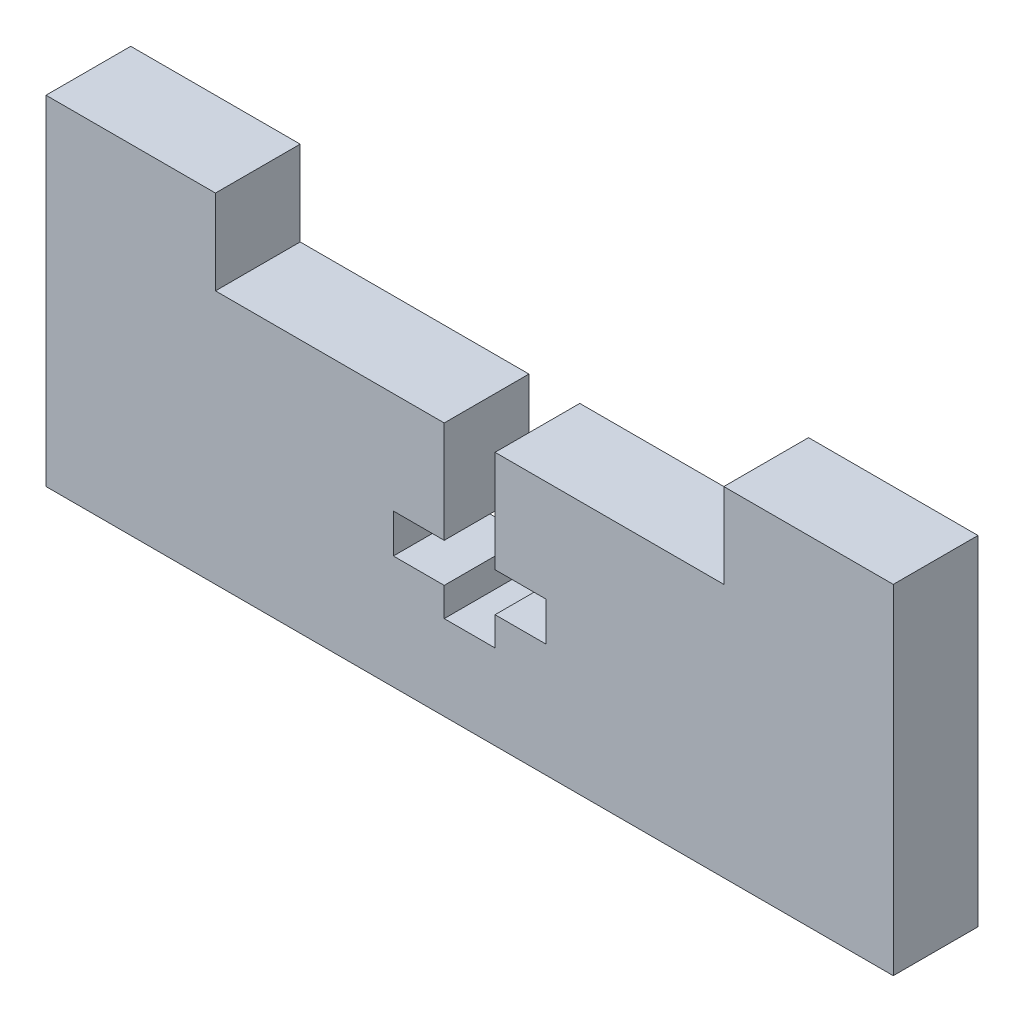
ISO-10303-21;
HEADER;
FILE_DESCRIPTION(('STEP AP214'),'2;1');
FILE_NAME('part.step','',(''),(''),'','','');
FILE_SCHEMA(('AUTOMOTIVE_DESIGN { 1 0 10303 214 1 1 1 1 }'));
ENDSEC;
DATA;
#1=APPLICATION_CONTEXT('core data for automotive mechanical design processes');
#2=APPLICATION_PROTOCOL_DEFINITION('international standard','automotive_design',2000,#1);
#3=PRODUCT_CONTEXT('',#1,'mechanical');
#4=PRODUCT('Part','Part','',(#3));
#5=PRODUCT_RELATED_PRODUCT_CATEGORY('part','',(#4));
#6=PRODUCT_DEFINITION_FORMATION('','',#4);
#7=PRODUCT_DEFINITION_CONTEXT('part definition',#1,'design');
#8=PRODUCT_DEFINITION('design','',#6,#7);
#9=PRODUCT_DEFINITION_SHAPE('','',#8);
#10=(LENGTH_UNIT() NAMED_UNIT(*) SI_UNIT(.MILLI.,.METRE.));
#11=(NAMED_UNIT(*) PLANE_ANGLE_UNIT() SI_UNIT($,.RADIAN.));
#12=(NAMED_UNIT(*) SI_UNIT($,.STERADIAN.) SOLID_ANGLE_UNIT());
#13=UNCERTAINTY_MEASURE_WITH_UNIT(LENGTH_MEASURE(1.E-05),#10,'distance_accuracy_value','');
#14=(GEOMETRIC_REPRESENTATION_CONTEXT(3) GLOBAL_UNCERTAINTY_ASSIGNED_CONTEXT((#13)) GLOBAL_UNIT_ASSIGNED_CONTEXT((#10,
#11,#12)) REPRESENTATION_CONTEXT('',''));
#15=CARTESIAN_POINT('',(0.,0.,0.));
#16=DIRECTION('',(0.,0.,1.));
#17=DIRECTION('',(1.,0.,0.));
#18=AXIS2_PLACEMENT_3D('',#15,#16,#17);
#19=CARTESIAN_POINT('',(26.5,0.,5.));
#20=DIRECTION('',(-1.,0.,0.));
#21=DIRECTION('',(0.,0.,1.));
#22=AXIS2_PLACEMENT_3D('',#19,#20,#21);
#23=PLANE('',#22);
#24=DIRECTION('',(0.,1.,0.));
#25=VECTOR('',#24,1.);
#26=CARTESIAN_POINT('',(26.5,0.,0.));
#27=LINE('',#26,#25);
#28=CARTESIAN_POINT('',(26.5,9.,0.));
#29=VERTEX_POINT('',#28);
#30=CARTESIAN_POINT('',(26.5,15.,0.));
#31=VERTEX_POINT('',#30);
#32=EDGE_CURVE('E212',#29,#31,#27,.T.);
#33=ORIENTED_EDGE('',*,*,#32,.F.);
#34=DIRECTION('',(0.,0.,-1.));
#35=VECTOR('',#34,1.);
#36=CARTESIAN_POINT('',(26.5,9.,5.));
#37=LINE('',#36,#35);
#38=CARTESIAN_POINT('',(26.5,9.,5.));
#39=VERTEX_POINT('',#38);
#40=EDGE_CURVE('E11',#39,#29,#37,.T.);
#41=ORIENTED_EDGE('',*,*,#40,.F.);
#42=DIRECTION('',(0.,1.,0.));
#43=VECTOR('',#42,1.);
#44=CARTESIAN_POINT('',(26.5,0.,5.));
#45=LINE('',#44,#43);
#46=CARTESIAN_POINT('',(26.5,15.,5.));
#47=VERTEX_POINT('',#46);
#48=EDGE_CURVE('E281',#39,#47,#45,.T.);
#49=ORIENTED_EDGE('',*,*,#48,.T.);
#50=DIRECTION('',(0.,0.,-1.));
#51=VECTOR('',#50,1.);
#52=CARTESIAN_POINT('',(26.5,15.,5.));
#53=LINE('',#52,#51);
#54=EDGE_CURVE('E56',#47,#31,#53,.T.);
#55=ORIENTED_EDGE('',*,*,#54,.T.);
#56=EDGE_LOOP('',(#33,#41,#49,#55));
#57=FACE_BOUND('',#56,.T.);
#58=ADVANCED_FACE('F39',(#57),#23,.T.);
#59=CARTESIAN_POINT('',(0.,8.99999999999992,5.));
#60=DIRECTION('',(0.,1.,0.));
#61=DIRECTION('',(-1.,0.,0.));
#62=AXIS2_PLACEMENT_3D('',#59,#60,#61);
#63=PLANE('',#62);
#64=DIRECTION('',(1.,0.,0.));
#65=VECTOR('',#64,1.);
#66=CARTESIAN_POINT('',(0.,8.99999999999992,0.));
#67=LINE('',#66,#65);
#68=CARTESIAN_POINT('',(29.5,9.00000000000001,0.));
#69=VERTEX_POINT('',#68);
#70=EDGE_CURVE('E215',#29,#69,#67,.T.);
#71=ORIENTED_EDGE('',*,*,#70,.T.);
#72=DIRECTION('',(0.,0.,-1.));
#73=VECTOR('',#72,1.);
#74=CARTESIAN_POINT('',(29.5,9.00000000000001,5.));
#75=LINE('',#74,#73);
#76=CARTESIAN_POINT('',(29.5,9.00000000000001,5.));
#77=VERTEX_POINT('',#76);
#78=EDGE_CURVE('E48',#77,#69,#75,.T.);
#79=ORIENTED_EDGE('',*,*,#78,.F.);
#80=DIRECTION('',(1.,0.,0.));
#81=VECTOR('',#80,1.);
#82=CARTESIAN_POINT('',(0.,8.99999999999992,5.));
#83=LINE('',#82,#81);
#84=EDGE_CURVE('E364',#39,#77,#83,.T.);
#85=ORIENTED_EDGE('',*,*,#84,.F.);
#86=ORIENTED_EDGE('',*,*,#40,.T.);
#87=EDGE_LOOP('',(#71,#79,#85,#86));
#88=FACE_BOUND('',#87,.T.);
#89=ADVANCED_FACE('F421',(#88),#63,.F.);
#90=CARTESIAN_POINT('',(29.5,0.,5.));
#91=DIRECTION('',(1.,0.,0.));
#92=DIRECTION('',(0.,0.,-1.));
#93=AXIS2_PLACEMENT_3D('',#90,#91,#92);
#94=PLANE('',#93);
#95=DIRECTION('',(0.,-1.,0.));
#96=VECTOR('',#95,1.);
#97=CARTESIAN_POINT('',(29.5,0.,0.));
#98=LINE('',#97,#96);
#99=CARTESIAN_POINT('',(29.5,6.69999999999999,0.));
#100=VERTEX_POINT('',#99);
#101=EDGE_CURVE('E218',#69,#100,#98,.T.);
#102=ORIENTED_EDGE('',*,*,#101,.T.);
#103=DIRECTION('',(0.,0.,-1.));
#104=VECTOR('',#103,1.);
#105=CARTESIAN_POINT('',(29.5,6.69999999999999,5.));
#106=LINE('',#105,#104);
#107=CARTESIAN_POINT('',(29.5,6.69999999999999,5.));
#108=VERTEX_POINT('',#107);
#109=EDGE_CURVE('E332',#108,#100,#106,.T.);
#110=ORIENTED_EDGE('',*,*,#109,.F.);
#111=DIRECTION('',(0.,-1.,0.));
#112=VECTOR('',#111,1.);
#113=CARTESIAN_POINT('',(29.5,0.,5.));
#114=LINE('',#113,#112);
#115=EDGE_CURVE('E343',#77,#108,#114,.T.);
#116=ORIENTED_EDGE('',*,*,#115,.F.);
#117=ORIENTED_EDGE('',*,*,#78,.T.);
#118=EDGE_LOOP('',(#102,#110,#116,#117));
#119=FACE_BOUND('',#118,.T.);
#120=ADVANCED_FACE('F341',(#119),#94,.F.);
#121=CARTESIAN_POINT('',(0.,6.70000000000009,5.));
#122=DIRECTION('',(0.,-1.,0.));
#123=DIRECTION('',(1.,0.,0.));
#124=AXIS2_PLACEMENT_3D('',#121,#122,#123);
#125=PLANE('',#124);
#126=DIRECTION('',(-1.,0.,0.));
#127=VECTOR('',#126,1.);
#128=CARTESIAN_POINT('',(0.,6.70000000000009,0.));
#129=LINE('',#128,#127);
#130=CARTESIAN_POINT('',(26.5,6.7,0.));
#131=VERTEX_POINT('',#130);
#132=EDGE_CURVE('E221',#100,#131,#129,.T.);
#133=ORIENTED_EDGE('',*,*,#132,.T.);
#134=DIRECTION('',(0.,0.,-1.));
#135=VECTOR('',#134,1.);
#136=CARTESIAN_POINT('',(26.5,6.7,5.));
#137=LINE('',#136,#135);
#138=CARTESIAN_POINT('',(26.5,6.7,5.));
#139=VERTEX_POINT('',#138);
#140=EDGE_CURVE('E329',#139,#131,#137,.T.);
#141=ORIENTED_EDGE('',*,*,#140,.F.);
#142=DIRECTION('',(-1.,0.,0.));
#143=VECTOR('',#142,1.);
#144=CARTESIAN_POINT('',(0.,6.70000000000009,5.));
#145=LINE('',#144,#143);
#146=EDGE_CURVE('E355',#108,#139,#145,.T.);
#147=ORIENTED_EDGE('',*,*,#146,.F.);
#148=ORIENTED_EDGE('',*,*,#109,.T.);
#149=EDGE_LOOP('',(#133,#141,#147,#148));
#150=FACE_BOUND('',#149,.T.);
#151=ADVANCED_FACE('F352',(#150),#125,.F.);
#152=CARTESIAN_POINT('',(26.5,0.,5.));
#153=DIRECTION('',(-1.,0.,0.));
#154=DIRECTION('',(0.,-1.,0.));
#155=AXIS2_PLACEMENT_3D('',#152,#153,#154);
#156=PLANE('',#155);
#157=DIRECTION('',(0.,1.,0.));
#158=VECTOR('',#157,1.);
#159=CARTESIAN_POINT('',(26.5,0.,0.));
#160=LINE('',#159,#158);
#161=CARTESIAN_POINT('',(26.5,4.99999999999999,0.));
#162=VERTEX_POINT('',#161);
#163=EDGE_CURVE('E225',#162,#131,#160,.T.);
#164=ORIENTED_EDGE('',*,*,#163,.F.);
#165=DIRECTION('',(0.,0.,-1.));
#166=VECTOR('',#165,1.);
#167=CARTESIAN_POINT('',(26.5,4.99999999999999,5.));
#168=LINE('',#167,#166);
#169=CARTESIAN_POINT('',(26.5,4.99999999999999,5.));
#170=VERTEX_POINT('',#169);
#171=EDGE_CURVE('E326',#170,#162,#168,.T.);
#172=ORIENTED_EDGE('',*,*,#171,.F.);
#173=DIRECTION('',(0.,1.,0.));
#174=VECTOR('',#173,1.);
#175=CARTESIAN_POINT('',(26.5,0.,5.));
#176=LINE('',#175,#174);
#177=EDGE_CURVE('E358',#170,#139,#176,.T.);
#178=ORIENTED_EDGE('',*,*,#177,.T.);
#179=ORIENTED_EDGE('',*,*,#140,.T.);
#180=EDGE_LOOP('',(#164,#172,#178,#179));
#181=FACE_BOUND('',#180,.T.);
#182=ADVANCED_FACE('F432',(#181),#156,.T.);
#183=CARTESIAN_POINT('',(0.,4.99999999999999,5.));
#184=DIRECTION('',(0.,1.,0.));
#185=DIRECTION('',(0.,0.,1.));
#186=AXIS2_PLACEMENT_3D('',#183,#184,#185);
#187=PLANE('',#186);
#188=DIRECTION('',(1.,0.,0.));
#189=VECTOR('',#188,1.);
#190=CARTESIAN_POINT('',(0.,4.99999999999999,0.));
#191=LINE('',#190,#189);
#192=CARTESIAN_POINT('',(23.5,4.99999999999999,0.));
#193=VERTEX_POINT('',#192);
#194=EDGE_CURVE('E229',#193,#162,#191,.T.);
#195=ORIENTED_EDGE('',*,*,#194,.F.);
#196=DIRECTION('',(0.,0.,-1.));
#197=VECTOR('',#196,1.);
#198=CARTESIAN_POINT('',(23.5,4.99999999999999,5.));
#199=LINE('',#198,#197);
#200=CARTESIAN_POINT('',(23.5,4.99999999999999,5.));
#201=VERTEX_POINT('',#200);
#202=EDGE_CURVE('E323',#201,#193,#199,.T.);
#203=ORIENTED_EDGE('',*,*,#202,.F.);
#204=DIRECTION('',(1.,0.,0.));
#205=VECTOR('',#204,1.);
#206=CARTESIAN_POINT('',(0.,4.99999999999999,5.));
#207=LINE('',#206,#205);
#208=EDGE_CURVE('E362',#201,#170,#207,.T.);
#209=ORIENTED_EDGE('',*,*,#208,.T.);
#210=ORIENTED_EDGE('',*,*,#171,.T.);
#211=EDGE_LOOP('',(#195,#203,#209,#210));
#212=FACE_BOUND('',#211,.T.);
#213=ADVANCED_FACE('F435',(#212),#187,.T.);
#214=CARTESIAN_POINT('',(23.5,0.,5.));
#215=DIRECTION('',(1.,0.,0.));
#216=DIRECTION('',(0.,0.,-1.));
#217=AXIS2_PLACEMENT_3D('',#214,#215,#216);
#218=PLANE('',#217);
#219=DIRECTION('',(0.,-1.,0.));
#220=VECTOR('',#219,1.);
#221=CARTESIAN_POINT('',(23.5,0.,0.));
#222=LINE('',#221,#220);
#223=CARTESIAN_POINT('',(23.5,6.7,0.));
#224=VERTEX_POINT('',#223);
#225=EDGE_CURVE('E233',#224,#193,#222,.T.);
#226=ORIENTED_EDGE('',*,*,#225,.F.);
#227=DIRECTION('',(0.,0.,-1.));
#228=VECTOR('',#227,1.);
#229=CARTESIAN_POINT('',(23.5,6.7,5.));
#230=LINE('',#229,#228);
#231=CARTESIAN_POINT('',(23.5,6.7,5.));
#232=VERTEX_POINT('',#231);
#233=EDGE_CURVE('E320',#232,#224,#230,.T.);
#234=ORIENTED_EDGE('',*,*,#233,.F.);
#235=DIRECTION('',(0.,-1.,0.));
#236=VECTOR('',#235,1.);
#237=CARTESIAN_POINT('',(23.5,0.,5.));
#238=LINE('',#237,#236);
#239=EDGE_CURVE('E371',#232,#201,#238,.T.);
#240=ORIENTED_EDGE('',*,*,#239,.T.);
#241=ORIENTED_EDGE('',*,*,#202,.T.);
#242=EDGE_LOOP('',(#226,#234,#240,#241));
#243=FACE_BOUND('',#242,.T.);
#244=ADVANCED_FACE('F439',(#243),#218,.T.);
#245=CARTESIAN_POINT('',(0.,6.69999999999997,5.));
#246=DIRECTION('',(0.,-1.,0.));
#247=DIRECTION('',(1.,0.,0.));
#248=AXIS2_PLACEMENT_3D('',#245,#246,#247);
#249=PLANE('',#248);
#250=DIRECTION('',(-1.,0.,0.));
#251=VECTOR('',#250,1.);
#252=CARTESIAN_POINT('',(0.,6.69999999999997,0.));
#253=LINE('',#252,#251);
#254=CARTESIAN_POINT('',(20.5,6.7,0.));
#255=VERTEX_POINT('',#254);
#256=EDGE_CURVE('E237',#224,#255,#253,.T.);
#257=ORIENTED_EDGE('',*,*,#256,.T.);
#258=DIRECTION('',(0.,0.,-1.));
#259=VECTOR('',#258,1.);
#260=CARTESIAN_POINT('',(20.5,6.7,5.));
#261=LINE('',#260,#259);
#262=CARTESIAN_POINT('',(20.5,6.7,5.));
#263=VERTEX_POINT('',#262);
#264=EDGE_CURVE('E316',#263,#255,#261,.T.);
#265=ORIENTED_EDGE('',*,*,#264,.F.);
#266=DIRECTION('',(-1.,0.,0.));
#267=VECTOR('',#266,1.);
#268=CARTESIAN_POINT('',(0.,6.69999999999997,5.));
#269=LINE('',#268,#267);
#270=EDGE_CURVE('E375',#232,#263,#269,.T.);
#271=ORIENTED_EDGE('',*,*,#270,.F.);
#272=ORIENTED_EDGE('',*,*,#233,.T.);
#273=EDGE_LOOP('',(#257,#265,#271,#272));
#274=FACE_BOUND('',#273,.T.);
#275=ADVANCED_FACE('F443',(#274),#249,.F.);
#276=CARTESIAN_POINT('',(20.5,0.,5.));
#277=DIRECTION('',(-1.,0.,0.));
#278=DIRECTION('',(0.,-1.,0.));
#279=AXIS2_PLACEMENT_3D('',#276,#277,#278);
#280=PLANE('',#279);
#281=DIRECTION('',(0.,1.,0.));
#282=VECTOR('',#281,1.);
#283=CARTESIAN_POINT('',(20.5,0.,0.));
#284=LINE('',#283,#282);
#285=CARTESIAN_POINT('',(20.5,9.,0.));
#286=VERTEX_POINT('',#285);
#287=EDGE_CURVE('E240',#255,#286,#284,.T.);
#288=ORIENTED_EDGE('',*,*,#287,.T.);
#289=DIRECTION('',(0.,0.,-1.));
#290=VECTOR('',#289,1.);
#291=CARTESIAN_POINT('',(20.5,9.,5.));
#292=LINE('',#291,#290);
#293=CARTESIAN_POINT('',(20.5,9.,5.));
#294=VERTEX_POINT('',#293);
#295=EDGE_CURVE('E312',#294,#286,#292,.T.);
#296=ORIENTED_EDGE('',*,*,#295,.F.);
#297=DIRECTION('',(0.,1.,0.));
#298=VECTOR('',#297,1.);
#299=CARTESIAN_POINT('',(20.5,0.,5.));
#300=LINE('',#299,#298);
#301=EDGE_CURVE('E378',#263,#294,#300,.T.);
#302=ORIENTED_EDGE('',*,*,#301,.F.);
#303=ORIENTED_EDGE('',*,*,#264,.T.);
#304=EDGE_LOOP('',(#288,#296,#302,#303));
#305=FACE_BOUND('',#304,.T.);
#306=ADVANCED_FACE('F447',(#305),#280,.F.);
#307=CARTESIAN_POINT('',(0.,9.00000000000002,5.));
#308=DIRECTION('',(0.,1.,0.));
#309=DIRECTION('',(-1.,0.,0.));
#310=AXIS2_PLACEMENT_3D('',#307,#308,#309);
#311=PLANE('',#310);
#312=DIRECTION('',(1.,0.,0.));
#313=VECTOR('',#312,1.);
#314=CARTESIAN_POINT('',(0.,9.00000000000002,0.));
#315=LINE('',#314,#313);
#316=CARTESIAN_POINT('',(23.5,9.,0.));
#317=VERTEX_POINT('',#316);
#318=EDGE_CURVE('E243',#286,#317,#315,.T.);
#319=ORIENTED_EDGE('',*,*,#318,.T.);
#320=DIRECTION('',(0.,0.,-1.));
#321=VECTOR('',#320,1.);
#322=CARTESIAN_POINT('',(23.5,9.,5.));
#323=LINE('',#322,#321);
#324=CARTESIAN_POINT('',(23.5,9.,5.));
#325=VERTEX_POINT('',#324);
#326=EDGE_CURVE('E309',#325,#317,#323,.T.);
#327=ORIENTED_EDGE('',*,*,#326,.F.);
#328=DIRECTION('',(1.,0.,0.));
#329=VECTOR('',#328,1.);
#330=CARTESIAN_POINT('',(0.,9.00000000000002,5.));
#331=LINE('',#330,#329);
#332=EDGE_CURVE('E381',#294,#325,#331,.T.);
#333=ORIENTED_EDGE('',*,*,#332,.F.);
#334=ORIENTED_EDGE('',*,*,#295,.T.);
#335=EDGE_LOOP('',(#319,#327,#333,#334));
#336=FACE_BOUND('',#335,.T.);
#337=ADVANCED_FACE('F451',(#336),#311,.F.);
#338=CARTESIAN_POINT('',(23.5,0.,5.));
#339=DIRECTION('',(1.,0.,0.));
#340=DIRECTION('',(0.,0.,-1.));
#341=AXIS2_PLACEMENT_3D('',#338,#339,#340);
#342=PLANE('',#341);
#343=DIRECTION('',(0.,-1.,0.));
#344=VECTOR('',#343,1.);
#345=CARTESIAN_POINT('',(23.5,0.,0.));
#346=LINE('',#345,#344);
#347=CARTESIAN_POINT('',(23.5,15.,0.));
#348=VERTEX_POINT('',#347);
#349=EDGE_CURVE('E247',#348,#317,#346,.T.);
#350=ORIENTED_EDGE('',*,*,#349,.F.);
#351=DIRECTION('',(0.,0.,-1.));
#352=VECTOR('',#351,1.);
#353=CARTESIAN_POINT('',(23.5,15.,5.));
#354=LINE('',#353,#352);
#355=CARTESIAN_POINT('',(23.5,15.,5.));
#356=VERTEX_POINT('',#355);
#357=EDGE_CURVE('E306',#356,#348,#354,.T.);
#358=ORIENTED_EDGE('',*,*,#357,.F.);
#359=DIRECTION('',(0.,-1.,0.));
#360=VECTOR('',#359,1.);
#361=CARTESIAN_POINT('',(23.5,0.,5.));
#362=LINE('',#361,#360);
#363=EDGE_CURVE('E384',#356,#325,#362,.T.);
#364=ORIENTED_EDGE('',*,*,#363,.T.);
#365=ORIENTED_EDGE('',*,*,#326,.T.);
#366=EDGE_LOOP('',(#350,#358,#364,#365));
#367=FACE_BOUND('',#366,.T.);
#368=ADVANCED_FACE('F455',(#367),#342,.T.);
#369=CARTESIAN_POINT('',(0.,15.,5.));
#370=DIRECTION('',(0.,-1.,0.));
#371=DIRECTION('',(1.,0.,0.));
#372=AXIS2_PLACEMENT_3D('',#369,#370,#371);
#373=PLANE('',#372);
#374=DIRECTION('',(-1.,0.,0.));
#375=VECTOR('',#374,1.);
#376=CARTESIAN_POINT('',(0.,15.,0.));
#377=LINE('',#376,#375);
#378=CARTESIAN_POINT('',(10.,15.,0.));
#379=VERTEX_POINT('',#378);
#380=EDGE_CURVE('E251',#348,#379,#377,.T.);
#381=ORIENTED_EDGE('',*,*,#380,.T.);
#382=DIRECTION('',(0.,0.,-1.));
#383=VECTOR('',#382,1.);
#384=CARTESIAN_POINT('',(10.,15.,5.));
#385=LINE('',#384,#383);
#386=CARTESIAN_POINT('',(10.,15.,5.));
#387=VERTEX_POINT('',#386);
#388=EDGE_CURVE('E302',#387,#379,#385,.T.);
#389=ORIENTED_EDGE('',*,*,#388,.F.);
#390=DIRECTION('',(-1.,0.,0.));
#391=VECTOR('',#390,1.);
#392=CARTESIAN_POINT('',(0.,15.,5.));
#393=LINE('',#392,#391);
#394=EDGE_CURVE('E388',#356,#387,#393,.T.);
#395=ORIENTED_EDGE('',*,*,#394,.F.);
#396=ORIENTED_EDGE('',*,*,#357,.T.);
#397=EDGE_LOOP('',(#381,#389,#395,#396));
#398=FACE_BOUND('',#397,.T.);
#399=ADVANCED_FACE('F459',(#398),#373,.F.);
#400=CARTESIAN_POINT('',(10.,0.,5.));
#401=DIRECTION('',(-1.,0.,0.));
#402=DIRECTION('',(0.,0.,1.));
#403=AXIS2_PLACEMENT_3D('',#400,#401,#402);
#404=PLANE('',#403);
#405=DIRECTION('',(0.,1.,0.));
#406=VECTOR('',#405,1.);
#407=CARTESIAN_POINT('',(10.,0.,0.));
#408=LINE('',#407,#406);
#409=CARTESIAN_POINT('',(10.,20.,0.));
#410=VERTEX_POINT('',#409);
#411=EDGE_CURVE('E254',#379,#410,#408,.T.);
#412=ORIENTED_EDGE('',*,*,#411,.T.);
#413=DIRECTION('',(0.,0.,-1.));
#414=VECTOR('',#413,1.);
#415=CARTESIAN_POINT('',(10.,20.,5.));
#416=LINE('',#415,#414);
#417=CARTESIAN_POINT('',(10.,20.,5.));
#418=VERTEX_POINT('',#417);
#419=EDGE_CURVE('E298',#418,#410,#416,.T.);
#420=ORIENTED_EDGE('',*,*,#419,.F.);
#421=DIRECTION('',(0.,1.,0.));
#422=VECTOR('',#421,1.);
#423=CARTESIAN_POINT('',(10.,0.,5.));
#424=LINE('',#423,#422);
#425=EDGE_CURVE('E391',#387,#418,#424,.T.);
#426=ORIENTED_EDGE('',*,*,#425,.F.);
#427=ORIENTED_EDGE('',*,*,#388,.T.);
#428=EDGE_LOOP('',(#412,#420,#426,#427));
#429=FACE_BOUND('',#428,.T.);
#430=ADVANCED_FACE('F463',(#429),#404,.F.);
#431=CARTESIAN_POINT('',(0.,20.,5.));
#432=DIRECTION('',(0.,-1.,0.));
#433=DIRECTION('',(1.,0.,0.));
#434=AXIS2_PLACEMENT_3D('',#431,#432,#433);
#435=PLANE('',#434);
#436=DIRECTION('',(-1.,0.,0.));
#437=VECTOR('',#436,1.);
#438=CARTESIAN_POINT('',(0.,20.,0.));
#439=LINE('',#438,#437);
#440=CARTESIAN_POINT('',(0.,20.,0.));
#441=VERTEX_POINT('',#440);
#442=EDGE_CURVE('E257',#410,#441,#439,.T.);
#443=ORIENTED_EDGE('',*,*,#442,.T.);
#444=DIRECTION('',(0.,0.,-1.));
#445=VECTOR('',#444,1.);
#446=CARTESIAN_POINT('',(0.,20.,5.));
#447=LINE('',#446,#445);
#448=CARTESIAN_POINT('',(0.,20.,5.));
#449=VERTEX_POINT('',#448);
#450=EDGE_CURVE('E295',#449,#441,#447,.T.);
#451=ORIENTED_EDGE('',*,*,#450,.F.);
#452=DIRECTION('',(-1.,0.,0.));
#453=VECTOR('',#452,1.);
#454=CARTESIAN_POINT('',(0.,20.,5.));
#455=LINE('',#454,#453);
#456=EDGE_CURVE('E394',#418,#449,#455,.T.);
#457=ORIENTED_EDGE('',*,*,#456,.F.);
#458=ORIENTED_EDGE('',*,*,#419,.T.);
#459=EDGE_LOOP('',(#443,#451,#457,#458));
#460=FACE_BOUND('',#459,.T.);
#461=ADVANCED_FACE('F467',(#460),#435,.F.);
#462=CARTESIAN_POINT('',(0.,0.,5.));
#463=DIRECTION('',(-1.,0.,0.));
#464=DIRECTION('',(0.,0.,1.));
#465=AXIS2_PLACEMENT_3D('',#462,#463,#464);
#466=PLANE('',#465);
#467=DIRECTION('',(0.,1.,0.));
#468=VECTOR('',#467,1.);
#469=CARTESIAN_POINT('',(0.,0.,0.));
#470=LINE('',#469,#468);
#471=CARTESIAN_POINT('',(0.,0.,0.));
#472=VERTEX_POINT('',#471);
#473=EDGE_CURVE('E261',#472,#441,#470,.T.);
#474=ORIENTED_EDGE('',*,*,#473,.F.);
#475=DIRECTION('',(0.,0.,-1.));
#476=VECTOR('',#475,1.);
#477=CARTESIAN_POINT('',(0.,0.,5.));
#478=LINE('',#477,#476);
#479=CARTESIAN_POINT('',(0.,0.,5.));
#480=VERTEX_POINT('',#479);
#481=EDGE_CURVE('E292',#480,#472,#478,.T.);
#482=ORIENTED_EDGE('',*,*,#481,.F.);
#483=DIRECTION('',(0.,1.,0.));
#484=VECTOR('',#483,1.);
#485=CARTESIAN_POINT('',(0.,0.,5.));
#486=LINE('',#485,#484);
#487=EDGE_CURVE('E397',#480,#449,#486,.T.);
#488=ORIENTED_EDGE('',*,*,#487,.T.);
#489=ORIENTED_EDGE('',*,*,#450,.T.);
#490=EDGE_LOOP('',(#474,#482,#488,#489));
#491=FACE_BOUND('',#490,.T.);
#492=ADVANCED_FACE('F471',(#491),#466,.T.);
#493=CARTESIAN_POINT('',(0.,0.,5.));
#494=DIRECTION('',(0.,1.,0.));
#495=DIRECTION('',(0.,0.,1.));
#496=AXIS2_PLACEMENT_3D('',#493,#494,#495);
#497=PLANE('',#496);
#498=DIRECTION('',(1.,0.,0.));
#499=VECTOR('',#498,1.);
#500=CARTESIAN_POINT('',(0.,0.,0.));
#501=LINE('',#500,#499);
#502=CARTESIAN_POINT('',(50.,0.,0.));
#503=VERTEX_POINT('',#502);
#504=EDGE_CURVE('E265',#472,#503,#501,.T.);
#505=ORIENTED_EDGE('',*,*,#504,.T.);
#506=DIRECTION('',(0.,0.,-1.));
#507=VECTOR('',#506,1.);
#508=CARTESIAN_POINT('',(50.,0.,5.));
#509=LINE('',#508,#507);
#510=CARTESIAN_POINT('',(50.,0.,5.));
#511=VERTEX_POINT('',#510);
#512=EDGE_CURVE('E288',#511,#503,#509,.T.);
#513=ORIENTED_EDGE('',*,*,#512,.F.);
#514=DIRECTION('',(1.,0.,0.));
#515=VECTOR('',#514,1.);
#516=CARTESIAN_POINT('',(0.,0.,5.));
#517=LINE('',#516,#515);
#518=EDGE_CURVE('E206',#480,#511,#517,.T.);
#519=ORIENTED_EDGE('',*,*,#518,.F.);
#520=ORIENTED_EDGE('',*,*,#481,.T.);
#521=EDGE_LOOP('',(#505,#513,#519,#520));
#522=FACE_BOUND('',#521,.T.);
#523=ADVANCED_FACE('F405',(#522),#497,.F.);
#524=CARTESIAN_POINT('',(50.,0.,5.));
#525=DIRECTION('',(-1.,0.,0.));
#526=DIRECTION('',(0.,0.,1.));
#527=AXIS2_PLACEMENT_3D('',#524,#525,#526);
#528=PLANE('',#527);
#529=DIRECTION('',(0.,1.,0.));
#530=VECTOR('',#529,1.);
#531=CARTESIAN_POINT('',(50.,0.,0.));
#532=LINE('',#531,#530);
#533=CARTESIAN_POINT('',(50.,20.,0.));
#534=VERTEX_POINT('',#533);
#535=EDGE_CURVE('E268',#503,#534,#532,.T.);
#536=ORIENTED_EDGE('',*,*,#535,.T.);
#537=DIRECTION('',(0.,0.,-1.));
#538=VECTOR('',#537,1.);
#539=CARTESIAN_POINT('',(50.,20.,5.));
#540=LINE('',#539,#538);
#541=CARTESIAN_POINT('',(50.,20.,5.));
#542=VERTEX_POINT('',#541);
#543=EDGE_CURVE('E189',#542,#534,#540,.T.);
#544=ORIENTED_EDGE('',*,*,#543,.F.);
#545=DIRECTION('',(0.,1.,0.));
#546=VECTOR('',#545,1.);
#547=CARTESIAN_POINT('',(50.,0.,5.));
#548=LINE('',#547,#546);
#549=EDGE_CURVE('E201',#511,#542,#548,.T.);
#550=ORIENTED_EDGE('',*,*,#549,.F.);
#551=ORIENTED_EDGE('',*,*,#512,.T.);
#552=EDGE_LOOP('',(#536,#544,#550,#551));
#553=FACE_BOUND('',#552,.T.);
#554=ADVANCED_FACE('F409',(#553),#528,.F.);
#555=CARTESIAN_POINT('',(0.,20.,5.));
#556=DIRECTION('',(0.,1.,0.));
#557=DIRECTION('',(-1.,0.,0.));
#558=AXIS2_PLACEMENT_3D('',#555,#556,#557);
#559=PLANE('',#558);
#560=DIRECTION('',(1.,0.,0.));
#561=VECTOR('',#560,1.);
#562=CARTESIAN_POINT('',(0.,20.,0.));
#563=LINE('',#562,#561);
#564=CARTESIAN_POINT('',(40.,20.,0.));
#565=VERTEX_POINT('',#564);
#566=EDGE_CURVE('E185',#565,#534,#563,.T.);
#567=ORIENTED_EDGE('',*,*,#566,.F.);
#568=DIRECTION('',(0.,0.,-1.));
#569=VECTOR('',#568,1.);
#570=CARTESIAN_POINT('',(40.,20.,5.));
#571=LINE('',#570,#569);
#572=CARTESIAN_POINT('',(40.,20.,5.));
#573=VERTEX_POINT('',#572);
#574=EDGE_CURVE('E179',#573,#565,#571,.T.);
#575=ORIENTED_EDGE('',*,*,#574,.F.);
#576=DIRECTION('',(1.,0.,0.));
#577=VECTOR('',#576,1.);
#578=CARTESIAN_POINT('',(0.,20.,5.));
#579=LINE('',#578,#577);
#580=EDGE_CURVE('E183',#573,#542,#579,.T.);
#581=ORIENTED_EDGE('',*,*,#580,.T.);
#582=ORIENTED_EDGE('',*,*,#543,.T.);
#583=EDGE_LOOP('',(#567,#575,#581,#582));
#584=FACE_BOUND('',#583,.T.);
#585=ADVANCED_FACE('F181',(#584),#559,.T.);
#586=CARTESIAN_POINT('',(40.,0.,5.));
#587=DIRECTION('',(1.,0.,0.));
#588=DIRECTION('',(0.,0.,-1.));
#589=AXIS2_PLACEMENT_3D('',#586,#587,#588);
#590=PLANE('',#589);
#591=DIRECTION('',(0.,-1.,0.));
#592=VECTOR('',#591,1.);
#593=CARTESIAN_POINT('',(40.,0.,0.));
#594=LINE('',#593,#592);
#595=CARTESIAN_POINT('',(40.,15.,0.));
#596=VERTEX_POINT('',#595);
#597=EDGE_CURVE('E274',#565,#596,#594,.T.);
#598=ORIENTED_EDGE('',*,*,#597,.T.);
#599=DIRECTION('',(0.,0.,-1.));
#600=VECTOR('',#599,1.);
#601=CARTESIAN_POINT('',(40.,15.,5.));
#602=LINE('',#601,#600);
#603=CARTESIAN_POINT('',(40.,15.,5.));
#604=VERTEX_POINT('',#603);
#605=EDGE_CURVE('E118',#604,#596,#602,.T.);
#606=ORIENTED_EDGE('',*,*,#605,.F.);
#607=DIRECTION('',(0.,-1.,0.));
#608=VECTOR('',#607,1.);
#609=CARTESIAN_POINT('',(40.,0.,5.));
#610=LINE('',#609,#608);
#611=EDGE_CURVE('E191',#573,#604,#610,.T.);
#612=ORIENTED_EDGE('',*,*,#611,.F.);
#613=ORIENTED_EDGE('',*,*,#574,.T.);
#614=EDGE_LOOP('',(#598,#606,#612,#613));
#615=FACE_BOUND('',#614,.T.);
#616=ADVANCED_FACE('F192',(#615),#590,.F.);
#617=CARTESIAN_POINT('',(0.,15.,5.));
#618=DIRECTION('',(0.,1.,0.));
#619=DIRECTION('',(-1.,0.,0.));
#620=AXIS2_PLACEMENT_3D('',#617,#618,#619);
#621=PLANE('',#620);
#622=DIRECTION('',(1.,0.,0.));
#623=VECTOR('',#622,1.);
#624=CARTESIAN_POINT('',(0.,15.,0.));
#625=LINE('',#624,#623);
#626=EDGE_CURVE('E277',#31,#596,#625,.T.);
#627=ORIENTED_EDGE('',*,*,#626,.F.);
#628=ORIENTED_EDGE('',*,*,#54,.F.);
#629=DIRECTION('',(1.,0.,0.));
#630=VECTOR('',#629,1.);
#631=CARTESIAN_POINT('',(0.,15.,5.));
#632=LINE('',#631,#630);
#633=EDGE_CURVE('E196',#47,#604,#632,.T.);
#634=ORIENTED_EDGE('',*,*,#633,.T.);
#635=ORIENTED_EDGE('',*,*,#605,.T.);
#636=EDGE_LOOP('',(#627,#628,#634,#635));
#637=FACE_BOUND('',#636,.T.);
#638=ADVANCED_FACE('F410',(#637),#621,.T.);
#639=CARTESIAN_POINT('',(0.,0.,5.));
#640=DIRECTION('',(0.,0.,1.));
#641=DIRECTION('',(1.,0.,0.));
#642=AXIS2_PLACEMENT_3D('',#639,#640,#641);
#643=PLANE('',#642);
#644=ORIENTED_EDGE('',*,*,#48,.F.);
#645=ORIENTED_EDGE('',*,*,#84,.T.);
#646=ORIENTED_EDGE('',*,*,#115,.T.);
#647=ORIENTED_EDGE('',*,*,#146,.T.);
#648=ORIENTED_EDGE('',*,*,#177,.F.);
#649=ORIENTED_EDGE('',*,*,#208,.F.);
#650=ORIENTED_EDGE('',*,*,#239,.F.);
#651=ORIENTED_EDGE('',*,*,#270,.T.);
#652=ORIENTED_EDGE('',*,*,#301,.T.);
#653=ORIENTED_EDGE('',*,*,#332,.T.);
#654=ORIENTED_EDGE('',*,*,#363,.F.);
#655=ORIENTED_EDGE('',*,*,#394,.T.);
#656=ORIENTED_EDGE('',*,*,#425,.T.);
#657=ORIENTED_EDGE('',*,*,#456,.T.);
#658=ORIENTED_EDGE('',*,*,#487,.F.);
#659=ORIENTED_EDGE('',*,*,#518,.T.);
#660=ORIENTED_EDGE('',*,*,#549,.T.);
#661=ORIENTED_EDGE('',*,*,#580,.F.);
#662=ORIENTED_EDGE('',*,*,#611,.T.);
#663=ORIENTED_EDGE('',*,*,#633,.F.);
#664=EDGE_LOOP('',(#644,#645,#646,#647,#648,#649,#650,#651,#652,#653,#654,#655,#656,#657,#658,
#659,#660,#661,#662,#663));
#665=FACE_BOUND('',#664,.T.);
#666=ADVANCED_FACE('F199',(#665),#643,.T.);
#667=CARTESIAN_POINT('',(0.,0.,0.));
#668=DIRECTION('',(0.,0.,1.));
#669=DIRECTION('',(1.,0.,0.));
#670=AXIS2_PLACEMENT_3D('',#667,#668,#669);
#671=PLANE('',#670);
#672=ORIENTED_EDGE('',*,*,#32,.T.);
#673=ORIENTED_EDGE('',*,*,#626,.T.);
#674=ORIENTED_EDGE('',*,*,#597,.F.);
#675=ORIENTED_EDGE('',*,*,#566,.T.);
#676=ORIENTED_EDGE('',*,*,#535,.F.);
#677=ORIENTED_EDGE('',*,*,#504,.F.);
#678=ORIENTED_EDGE('',*,*,#473,.T.);
#679=ORIENTED_EDGE('',*,*,#442,.F.);
#680=ORIENTED_EDGE('',*,*,#411,.F.);
#681=ORIENTED_EDGE('',*,*,#380,.F.);
#682=ORIENTED_EDGE('',*,*,#349,.T.);
#683=ORIENTED_EDGE('',*,*,#318,.F.);
#684=ORIENTED_EDGE('',*,*,#287,.F.);
#685=ORIENTED_EDGE('',*,*,#256,.F.);
#686=ORIENTED_EDGE('',*,*,#225,.T.);
#687=ORIENTED_EDGE('',*,*,#194,.T.);
#688=ORIENTED_EDGE('',*,*,#163,.T.);
#689=ORIENTED_EDGE('',*,*,#132,.F.);
#690=ORIENTED_EDGE('',*,*,#101,.F.);
#691=ORIENTED_EDGE('',*,*,#70,.F.);
#692=EDGE_LOOP('',(#672,#673,#674,#675,#676,#677,#678,#679,#680,#681,#682,#683,#684,#685,#686,
#687,#688,#689,#690,#691));
#693=FACE_BOUND('',#692,.T.);
#694=ADVANCED_FACE('F348',(#693),#671,.F.);
#695=CLOSED_SHELL('',(#58,#89,#120,#151,#182,#213,#244,#275,#306,#337,#368,#399,#430,#461,#492,
#523,#554,#585,#616,#638,#666,#694));
#696=MANIFOLD_SOLID_BREP('B2',#695);
#697=ADVANCED_BREP_SHAPE_REPRESENTATION('',(#18,#696),#14);
#698=SHAPE_DEFINITION_REPRESENTATION(#9,#697);
ENDSEC;
END-ISO-10303-21;
